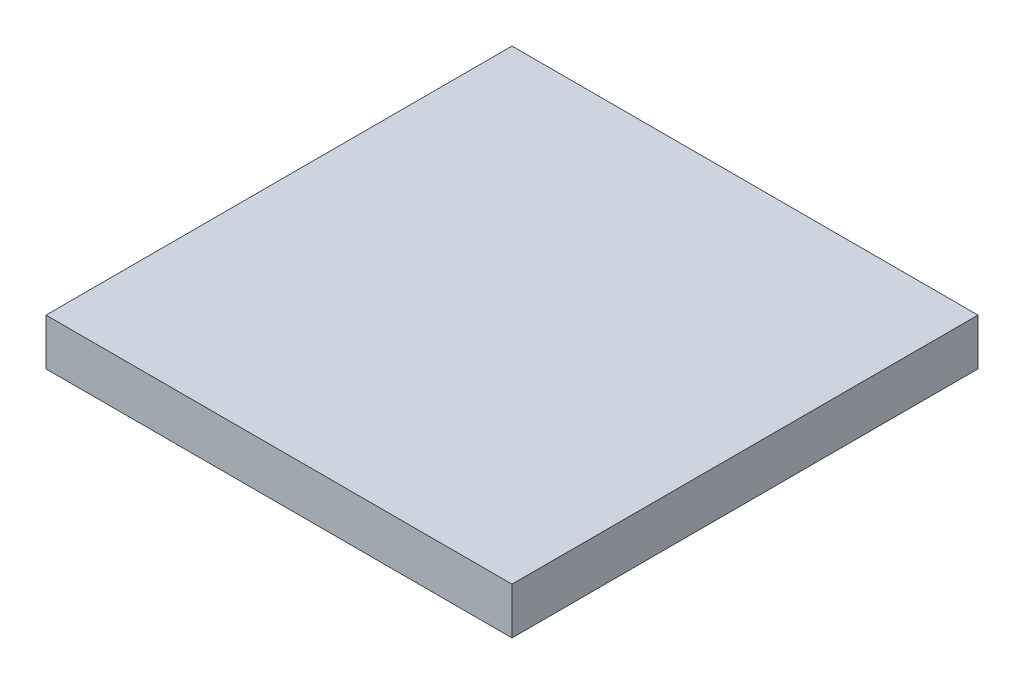
ISO-10303-21;
HEADER;
FILE_DESCRIPTION(('STEP AP214'),'2;1');
FILE_NAME('part.step','',(''),(''),'','','');
FILE_SCHEMA(('AUTOMOTIVE_DESIGN { 1 0 10303 214 1 1 1 1 }'));
ENDSEC;
DATA;
#1=APPLICATION_CONTEXT('core data for automotive mechanical design processes');
#2=APPLICATION_PROTOCOL_DEFINITION('international standard','automotive_design',2000,#1);
#3=PRODUCT_CONTEXT('',#1,'mechanical');
#4=PRODUCT('Part','Part','',(#3));
#5=PRODUCT_RELATED_PRODUCT_CATEGORY('part','',(#4));
#6=PRODUCT_DEFINITION_FORMATION('','',#4);
#7=PRODUCT_DEFINITION_CONTEXT('part definition',#1,'design');
#8=PRODUCT_DEFINITION('design','',#6,#7);
#9=PRODUCT_DEFINITION_SHAPE('','',#8);
#10=(LENGTH_UNIT() NAMED_UNIT(*) SI_UNIT(.MILLI.,.METRE.));
#11=(NAMED_UNIT(*) PLANE_ANGLE_UNIT() SI_UNIT($,.RADIAN.));
#12=(NAMED_UNIT(*) SI_UNIT($,.STERADIAN.) SOLID_ANGLE_UNIT());
#13=UNCERTAINTY_MEASURE_WITH_UNIT(LENGTH_MEASURE(1.E-05),#10,'distance_accuracy_value','');
#14=(GEOMETRIC_REPRESENTATION_CONTEXT(3) GLOBAL_UNCERTAINTY_ASSIGNED_CONTEXT((#13)) GLOBAL_UNIT_ASSIGNED_CONTEXT((#10,
#11,#12)) REPRESENTATION_CONTEXT('',''));
#15=CARTESIAN_POINT('',(0.,0.,0.));
#16=DIRECTION('',(0.,0.,1.));
#17=DIRECTION('',(1.,0.,0.));
#18=AXIS2_PLACEMENT_3D('',#15,#16,#17);
#19=CARTESIAN_POINT('',(50.,10.,-50.));
#20=DIRECTION('',(-1.,0.,0.));
#21=DIRECTION('',(0.,0.,1.));
#22=AXIS2_PLACEMENT_3D('',#19,#20,#21);
#23=PLANE('',#22);
#24=DIRECTION('',(0.,0.,-1.));
#25=VECTOR('',#24,1.);
#26=CARTESIAN_POINT('',(50.,0.,-50.));
#27=LINE('',#26,#25);
#28=CARTESIAN_POINT('',(50.,0.,50.));
#29=VERTEX_POINT('',#28);
#30=CARTESIAN_POINT('',(50.,0.,-50.));
#31=VERTEX_POINT('',#30);
#32=EDGE_CURVE('E104',#29,#31,#27,.T.);
#33=ORIENTED_EDGE('',*,*,#32,.T.);
#34=DIRECTION('',(0.,-1.,0.));
#35=VECTOR('',#34,1.);
#36=CARTESIAN_POINT('',(50.,10.,-50.));
#37=LINE('',#36,#35);
#38=CARTESIAN_POINT('',(50.,10.,-50.));
#39=VERTEX_POINT('',#38);
#40=EDGE_CURVE('E11',#39,#31,#37,.T.);
#41=ORIENTED_EDGE('',*,*,#40,.F.);
#42=DIRECTION('',(0.,0.,-1.));
#43=VECTOR('',#42,1.);
#44=CARTESIAN_POINT('',(50.,10.,-50.));
#45=LINE('',#44,#43);
#46=CARTESIAN_POINT('',(50.,10.,50.));
#47=VERTEX_POINT('',#46);
#48=EDGE_CURVE('E92',#47,#39,#45,.T.);
#49=ORIENTED_EDGE('',*,*,#48,.F.);
#50=DIRECTION('',(0.,-1.,0.));
#51=VECTOR('',#50,1.);
#52=CARTESIAN_POINT('',(50.,10.,50.));
#53=LINE('',#52,#51);
#54=EDGE_CURVE('E100',#47,#29,#53,.T.);
#55=ORIENTED_EDGE('',*,*,#54,.T.);
#56=EDGE_LOOP('',(#33,#41,#49,#55));
#57=FACE_BOUND('',#56,.T.);
#58=ADVANCED_FACE('F41',(#57),#23,.F.);
#59=CARTESIAN_POINT('',(-50.,10.,-50.));
#60=DIRECTION('',(0.,0.,1.));
#61=DIRECTION('',(1.,0.,0.));
#62=AXIS2_PLACEMENT_3D('',#59,#60,#61);
#63=PLANE('',#62);
#64=DIRECTION('',(-1.,0.,0.));
#65=VECTOR('',#64,1.);
#66=CARTESIAN_POINT('',(-50.,0.,-50.));
#67=LINE('',#66,#65);
#68=CARTESIAN_POINT('',(-50.,0.,-50.));
#69=VERTEX_POINT('',#68);
#70=EDGE_CURVE('E96',#31,#69,#67,.T.);
#71=ORIENTED_EDGE('',*,*,#70,.T.);
#72=DIRECTION('',(0.,-1.,0.));
#73=VECTOR('',#72,1.);
#74=CARTESIAN_POINT('',(-50.,10.,-50.));
#75=LINE('',#74,#73);
#76=CARTESIAN_POINT('',(-50.,10.,-50.));
#77=VERTEX_POINT('',#76);
#78=EDGE_CURVE('E49',#77,#69,#75,.T.);
#79=ORIENTED_EDGE('',*,*,#78,.F.);
#80=DIRECTION('',(-1.,0.,0.));
#81=VECTOR('',#80,1.);
#82=CARTESIAN_POINT('',(-50.,10.,-50.));
#83=LINE('',#82,#81);
#84=EDGE_CURVE('E87',#39,#77,#83,.T.);
#85=ORIENTED_EDGE('',*,*,#84,.F.);
#86=ORIENTED_EDGE('',*,*,#40,.T.);
#87=EDGE_LOOP('',(#71,#79,#85,#86));
#88=FACE_BOUND('',#87,.T.);
#89=ADVANCED_FACE('F95',(#88),#63,.F.);
#90=CARTESIAN_POINT('',(-50.,10.,-50.));
#91=DIRECTION('',(1.,0.,0.));
#92=DIRECTION('',(0.,0.,-1.));
#93=AXIS2_PLACEMENT_3D('',#90,#91,#92);
#94=PLANE('',#93);
#95=DIRECTION('',(0.,0.,1.));
#96=VECTOR('',#95,1.);
#97=CARTESIAN_POINT('',(-50.,0.,-50.));
#98=LINE('',#97,#96);
#99=CARTESIAN_POINT('',(-50.,0.,50.));
#100=VERTEX_POINT('',#99);
#101=EDGE_CURVE('E74',#69,#100,#98,.T.);
#102=ORIENTED_EDGE('',*,*,#101,.T.);
#103=DIRECTION('',(0.,-1.,0.));
#104=VECTOR('',#103,1.);
#105=CARTESIAN_POINT('',(-50.,10.,50.));
#106=LINE('',#105,#104);
#107=CARTESIAN_POINT('',(-50.,10.,50.));
#108=VERTEX_POINT('',#107);
#109=EDGE_CURVE('E97',#108,#100,#106,.T.);
#110=ORIENTED_EDGE('',*,*,#109,.F.);
#111=DIRECTION('',(0.,0.,1.));
#112=VECTOR('',#111,1.);
#113=CARTESIAN_POINT('',(-50.,10.,-50.));
#114=LINE('',#113,#112);
#115=EDGE_CURVE('E90',#77,#108,#114,.T.);
#116=ORIENTED_EDGE('',*,*,#115,.F.);
#117=ORIENTED_EDGE('',*,*,#78,.T.);
#118=EDGE_LOOP('',(#102,#110,#116,#117));
#119=FACE_BOUND('',#118,.T.);
#120=ADVANCED_FACE('F98',(#119),#94,.F.);
#121=CARTESIAN_POINT('',(-50.,10.,50.));
#122=DIRECTION('',(0.,0.,-1.));
#123=DIRECTION('',(-1.,0.,0.));
#124=AXIS2_PLACEMENT_3D('',#121,#122,#123);
#125=PLANE('',#124);
#126=DIRECTION('',(1.,0.,0.));
#127=VECTOR('',#126,1.);
#128=CARTESIAN_POINT('',(-50.,0.,50.));
#129=LINE('',#128,#127);
#130=EDGE_CURVE('E80',#100,#29,#129,.T.);
#131=ORIENTED_EDGE('',*,*,#130,.T.);
#132=ORIENTED_EDGE('',*,*,#54,.F.);
#133=DIRECTION('',(1.,0.,0.));
#134=VECTOR('',#133,1.);
#135=CARTESIAN_POINT('',(-50.,10.,50.));
#136=LINE('',#135,#134);
#137=EDGE_CURVE('E57',#108,#47,#136,.T.);
#138=ORIENTED_EDGE('',*,*,#137,.F.);
#139=ORIENTED_EDGE('',*,*,#109,.T.);
#140=EDGE_LOOP('',(#131,#132,#138,#139));
#141=FACE_BOUND('',#140,.T.);
#142=ADVANCED_FACE('F111',(#141),#125,.F.);
#143=CARTESIAN_POINT('',(0.,10.,0.));
#144=DIRECTION('',(0.,1.,0.));
#145=DIRECTION('',(0.,0.,1.));
#146=AXIS2_PLACEMENT_3D('',#143,#144,#145);
#147=PLANE('',#146);
#148=ORIENTED_EDGE('',*,*,#48,.T.);
#149=ORIENTED_EDGE('',*,*,#84,.T.);
#150=ORIENTED_EDGE('',*,*,#115,.T.);
#151=ORIENTED_EDGE('',*,*,#137,.T.);
#152=EDGE_LOOP('',(#148,#149,#150,#151));
#153=FACE_BOUND('',#152,.T.);
#154=ADVANCED_FACE('F88',(#153),#147,.T.);
#155=CARTESIAN_POINT('',(0.,0.,0.));
#156=DIRECTION('',(0.,1.,0.));
#157=DIRECTION('',(0.,0.,1.));
#158=AXIS2_PLACEMENT_3D('',#155,#156,#157);
#159=PLANE('',#158);
#160=ORIENTED_EDGE('',*,*,#32,.F.);
#161=ORIENTED_EDGE('',*,*,#130,.F.);
#162=ORIENTED_EDGE('',*,*,#101,.F.);
#163=ORIENTED_EDGE('',*,*,#70,.F.);
#164=EDGE_LOOP('',(#160,#161,#162,#163));
#165=FACE_BOUND('',#164,.T.);
#166=ADVANCED_FACE('F114',(#165),#159,.F.);
#167=CLOSED_SHELL('',(#58,#89,#120,#142,#154,#166));
#168=MANIFOLD_SOLID_BREP('B2',#167);
#169=ADVANCED_BREP_SHAPE_REPRESENTATION('',(#18,#168),#14);
#170=SHAPE_DEFINITION_REPRESENTATION(#9,#169);
ENDSEC;
END-ISO-10303-21;
